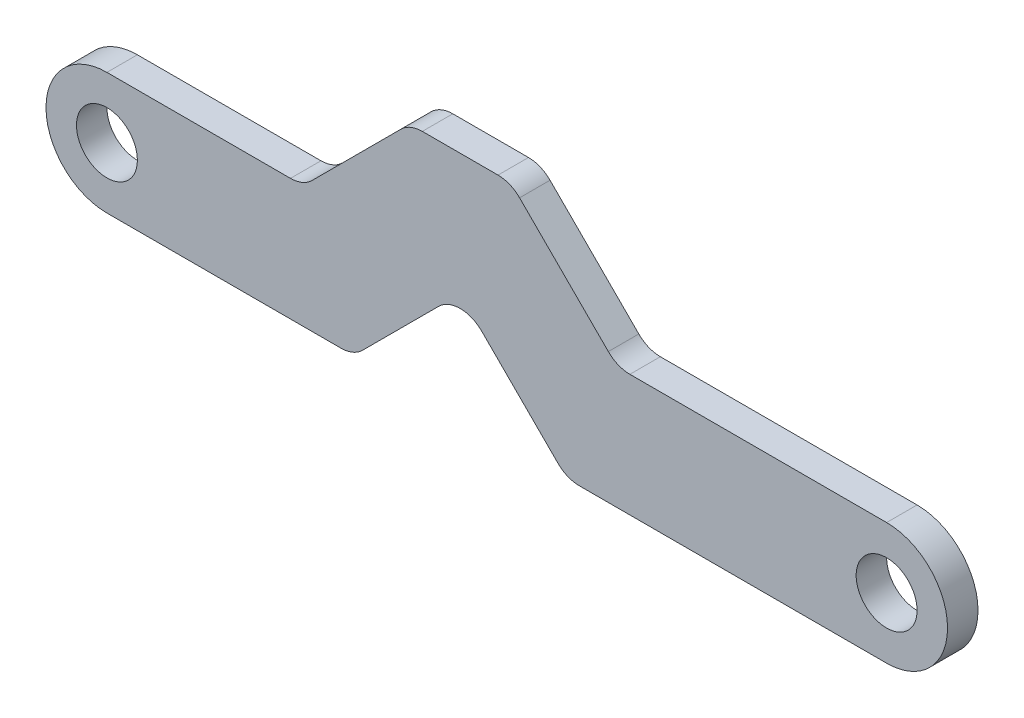
ISO-10303-21;
HEADER;
FILE_DESCRIPTION(('STEP AP214'),'2;1');
FILE_NAME('part.step','',(''),(''),'','','');
FILE_SCHEMA(('AUTOMOTIVE_DESIGN { 1 0 10303 214 1 1 1 1 }'));
ENDSEC;
DATA;
#1=APPLICATION_CONTEXT('core data for automotive mechanical design processes');
#2=APPLICATION_PROTOCOL_DEFINITION('international standard','automotive_design',2000,#1);
#3=PRODUCT_CONTEXT('',#1,'mechanical');
#4=PRODUCT('Part','Part','',(#3));
#5=PRODUCT_RELATED_PRODUCT_CATEGORY('part','',(#4));
#6=PRODUCT_DEFINITION_FORMATION('','',#4);
#7=PRODUCT_DEFINITION_CONTEXT('part definition',#1,'design');
#8=PRODUCT_DEFINITION('design','',#6,#7);
#9=PRODUCT_DEFINITION_SHAPE('','',#8);
#10=(LENGTH_UNIT() NAMED_UNIT(*) SI_UNIT(.MILLI.,.METRE.));
#11=(NAMED_UNIT(*) PLANE_ANGLE_UNIT() SI_UNIT($,.RADIAN.));
#12=(NAMED_UNIT(*) SI_UNIT($,.STERADIAN.) SOLID_ANGLE_UNIT());
#13=UNCERTAINTY_MEASURE_WITH_UNIT(LENGTH_MEASURE(1.E-05),#10,'distance_accuracy_value','');
#14=(GEOMETRIC_REPRESENTATION_CONTEXT(3) GLOBAL_UNCERTAINTY_ASSIGNED_CONTEXT((#13)) GLOBAL_UNIT_ASSIGNED_CONTEXT((#10,
#11,#12)) REPRESENTATION_CONTEXT('',''));
#15=CARTESIAN_POINT('',(0.,0.,0.));
#16=DIRECTION('',(0.,0.,1.));
#17=DIRECTION('',(1.,0.,0.));
#18=AXIS2_PLACEMENT_3D('',#15,#16,#17);
#19=CARTESIAN_POINT('',(0.,-2.,0.5));
#20=DIRECTION('',(0.,1.,0.));
#21=DIRECTION('',(-1.,0.,0.));
#22=AXIS2_PLACEMENT_3D('',#19,#20,#21);
#23=PLANE('',#22);
#24=DIRECTION('',(1.,0.,0.));
#25=VECTOR('',#24,1.);
#26=CARTESIAN_POINT('',(0.,-2.,0.5));
#27=LINE('',#26,#25);
#28=CARTESIAN_POINT('',(-10.0857864376269,-2.,0.5));
#29=VERTEX_POINT('',#28);
#30=CARTESIAN_POINT('',(0.,-2.,0.5));
#31=VERTEX_POINT('',#30);
#32=EDGE_CURVE('E163',#29,#31,#27,.T.);
#33=ORIENTED_EDGE('',*,*,#32,.F.);
#34=DIRECTION('',(0.,0.,1.));
#35=VECTOR('',#34,1.);
#36=CARTESIAN_POINT('',(-10.0857864376269,-2.,-0.5));
#37=LINE('',#36,#35);
#38=CARTESIAN_POINT('',(-10.0857864376269,-2.,-0.5));
#39=VERTEX_POINT('',#38);
#40=EDGE_CURVE('E53',#29,#39,#37,.F.);
#41=ORIENTED_EDGE('',*,*,#40,.T.);
#42=DIRECTION('',(1.,0.,0.));
#43=VECTOR('',#42,1.);
#44=CARTESIAN_POINT('',(0.,-2.,-0.5));
#45=LINE('',#44,#43);
#46=CARTESIAN_POINT('',(0.,-2.,-0.5));
#47=VERTEX_POINT('',#46);
#48=EDGE_CURVE('E185',#39,#47,#45,.T.);
#49=ORIENTED_EDGE('',*,*,#48,.T.);
#50=DIRECTION('',(0.,0.,-1.));
#51=VECTOR('',#50,1.);
#52=CARTESIAN_POINT('',(0.,-2.,0.5));
#53=LINE('',#52,#51);
#54=EDGE_CURVE('E180',#31,#47,#53,.T.);
#55=ORIENTED_EDGE('',*,*,#54,.F.);
#56=EDGE_LOOP('',(#33,#41,#49,#55));
#57=FACE_BOUND('',#56,.T.);
#58=ADVANCED_FACE('F38',(#57),#23,.F.);
#59=CARTESIAN_POINT('',(0.,0.,0.5));
#60=DIRECTION('',(0.,0.,1.));
#61=DIRECTION('',(1.,0.,0.));
#62=AXIS2_PLACEMENT_3D('',#59,#60,#61);
#63=PLANE('',#62);
#64=CARTESIAN_POINT('',(-25.5979,0.,0.5));
#65=DIRECTION('',(0.,0.,1.));
#66=DIRECTION('',(1.,0.,0.));
#67=AXIS2_PLACEMENT_3D('',#64,#65,#66);
#68=CIRCLE('',#67,1.);
#69=CARTESIAN_POINT('',(-24.5979,0.,0.5));
#70=VERTEX_POINT('',#69);
#71=EDGE_CURVE('E275',#70,#70,#68,.T.);
#72=ORIENTED_EDGE('',*,*,#71,.F.);
#73=EDGE_LOOP('',(#72));
#74=FACE_BOUND('',#73,.T.);
#75=CARTESIAN_POINT('',(0.,0.,0.5));
#76=DIRECTION('',(0.,0.,1.));
#77=DIRECTION('',(1.,0.,0.));
#78=AXIS2_PLACEMENT_3D('',#75,#76,#77);
#79=CIRCLE('',#78,1.);
#80=CARTESIAN_POINT('',(1.,0.,0.5));
#81=VERTEX_POINT('',#80);
#82=EDGE_CURVE('E278',#81,#81,#79,.T.);
#83=ORIENTED_EDGE('',*,*,#82,.F.);
#84=EDGE_LOOP('',(#83));
#85=FACE_BOUND('',#84,.T.);
#86=DIRECTION('',(0.707106781186548,-0.707106781186548,0.));
#87=VECTOR('',#86,1.);
#88=CARTESIAN_POINT('',(-3.42157287525381,-3.42157287525381,0.5));
#89=LINE('',#88,#87);
#90=CARTESIAN_POINT('',(-12.0502525316942,5.20710678118655,0.5));
#91=VERTEX_POINT('',#90);
#92=CARTESIAN_POINT('',(-9.13603896932107,2.29289321881345,0.5));
#93=VERTEX_POINT('',#92);
#94=EDGE_CURVE('E268',#91,#93,#89,.T.);
#95=ORIENTED_EDGE('',*,*,#94,.F.);
#96=CARTESIAN_POINT('',(-12.7573593128807,4.5,0.5));
#97=DIRECTION('',(0.,0.,1.));
#98=DIRECTION('',(1.,0.,0.));
#99=AXIS2_PLACEMENT_3D('',#96,#97,#98);
#100=CIRCLE('',#99,1.);
#101=CARTESIAN_POINT('',(-12.7573593128807,5.5,0.5));
#102=VERTEX_POINT('',#101);
#103=EDGE_CURVE('E230',#91,#102,#100,.T.);
#104=ORIENTED_EDGE('',*,*,#103,.T.);
#105=DIRECTION('',(1.,0.,0.));
#106=VECTOR('',#105,1.);
#107=CARTESIAN_POINT('',(0.,5.5,0.5));
#108=LINE('',#107,#106);
#109=CARTESIAN_POINT('',(-15.2426406871193,5.5,0.5));
#110=VERTEX_POINT('',#109);
#111=EDGE_CURVE('E324',#110,#102,#108,.T.);
#112=ORIENTED_EDGE('',*,*,#111,.F.);
#113=CARTESIAN_POINT('',(-15.2426406871193,4.5,0.5));
#114=DIRECTION('',(0.,0.,1.));
#115=DIRECTION('',(1.,0.,0.));
#116=AXIS2_PLACEMENT_3D('',#113,#114,#115);
#117=CIRCLE('',#116,1.);
#118=CARTESIAN_POINT('',(-15.9497474683058,5.20710678118654,0.5));
#119=VERTEX_POINT('',#118);
#120=EDGE_CURVE('E228',#110,#119,#117,.T.);
#121=ORIENTED_EDGE('',*,*,#120,.T.);
#122=DIRECTION('',(-0.707106781186548,-0.707106781186548,0.));
#123=VECTOR('',#122,1.);
#124=CARTESIAN_POINT('',(-10.5784271247462,10.5784271247462,0.5));
#125=LINE('',#124,#123);
#126=CARTESIAN_POINT('',(-18.8639610306789,2.29289321881345,0.5));
#127=VERTEX_POINT('',#126);
#128=EDGE_CURVE('E326',#119,#127,#125,.T.);
#129=ORIENTED_EDGE('',*,*,#128,.T.);
#130=CARTESIAN_POINT('',(-19.5710678118655,3.,0.5));
#131=DIRECTION('',(0.,0.,1.));
#132=DIRECTION('',(1.,0.,0.));
#133=AXIS2_PLACEMENT_3D('',#130,#131,#132);
#134=CIRCLE('',#133,1.);
#135=CARTESIAN_POINT('',(-19.5710678118655,2.,0.5));
#136=VERTEX_POINT('',#135);
#137=EDGE_CURVE('E217',#127,#136,#134,.F.);
#138=ORIENTED_EDGE('',*,*,#137,.T.);
#139=DIRECTION('',(1.,0.,0.));
#140=VECTOR('',#139,1.);
#141=CARTESIAN_POINT('',(0.,2.,0.5));
#142=LINE('',#141,#140);
#143=CARTESIAN_POINT('',(-25.5979,2.,0.5));
#144=VERTEX_POINT('',#143);
#145=EDGE_CURVE('E271',#144,#136,#142,.T.);
#146=ORIENTED_EDGE('',*,*,#145,.F.);
#147=CARTESIAN_POINT('',(-25.5979,0.,0.5));
#148=DIRECTION('',(0.,0.,1.));
#149=DIRECTION('',(1.,0.,0.));
#150=AXIS2_PLACEMENT_3D('',#147,#148,#149);
#151=CIRCLE('',#150,2.);
#152=CARTESIAN_POINT('',(-25.5979,-2.,0.5));
#153=VERTEX_POINT('',#152);
#154=EDGE_CURVE('E265',#144,#153,#151,.T.);
#155=ORIENTED_EDGE('',*,*,#154,.T.);
#156=CARTESIAN_POINT('',(-17.9142135623731,-2.,0.5));
#157=VERTEX_POINT('',#156);
#158=EDGE_CURVE('E173',#153,#157,#27,.T.);
#159=ORIENTED_EDGE('',*,*,#158,.T.);
#160=CARTESIAN_POINT('',(-17.9142135623731,-1.,0.5));
#161=DIRECTION('',(0.,0.,1.));
#162=DIRECTION('',(1.,0.,0.));
#163=AXIS2_PLACEMENT_3D('',#160,#161,#162);
#164=CIRCLE('',#163,1.);
#165=CARTESIAN_POINT('',(-17.2071067811865,-1.70710678118655,0.5));
#166=VERTEX_POINT('',#165);
#167=EDGE_CURVE('E225',#157,#166,#164,.T.);
#168=ORIENTED_EDGE('',*,*,#167,.T.);
#169=DIRECTION('',(-0.707106781186548,-0.707106781186548,0.));
#170=VECTOR('',#169,1.);
#171=CARTESIAN_POINT('',(-7.75,7.75,0.5));
#172=LINE('',#171,#170);
#173=CARTESIAN_POINT('',(-14.7071067811865,0.79289321881345,0.5));
#174=VERTEX_POINT('',#173);
#175=EDGE_CURVE('E335',#174,#166,#172,.T.);
#176=ORIENTED_EDGE('',*,*,#175,.F.);
#177=CARTESIAN_POINT('',(-14.,0.0857864376269026,0.5));
#178=DIRECTION('',(0.,0.,1.));
#179=DIRECTION('',(1.,0.,0.));
#180=AXIS2_PLACEMENT_3D('',#177,#178,#179);
#181=CIRCLE('',#180,1.);
#182=CARTESIAN_POINT('',(-13.2928932188135,0.79289321881345,0.5));
#183=VERTEX_POINT('',#182);
#184=EDGE_CURVE('E213',#174,#183,#181,.F.);
#185=ORIENTED_EDGE('',*,*,#184,.T.);
#186=DIRECTION('',(0.707106781186548,-0.707106781186548,0.));
#187=VECTOR('',#186,1.);
#188=CARTESIAN_POINT('',(-6.25,-6.25,0.5));
#189=LINE('',#188,#187);
#190=CARTESIAN_POINT('',(-10.7928932188135,-1.70710678118655,0.5));
#191=VERTEX_POINT('',#190);
#192=EDGE_CURVE('E337',#183,#191,#189,.T.);
#193=ORIENTED_EDGE('',*,*,#192,.T.);
#194=CARTESIAN_POINT('',(-10.0857864376269,-1.,0.5));
#195=DIRECTION('',(0.,0.,1.));
#196=DIRECTION('',(1.,0.,0.));
#197=AXIS2_PLACEMENT_3D('',#194,#195,#196);
#198=CIRCLE('',#197,1.);
#199=EDGE_CURVE('E171',#191,#29,#198,.T.);
#200=ORIENTED_EDGE('',*,*,#199,.T.);
#201=ORIENTED_EDGE('',*,*,#32,.T.);
#202=CARTESIAN_POINT('',(0.,0.,0.5));
#203=DIRECTION('',(0.,0.,1.));
#204=DIRECTION('',(1.,0.,0.));
#205=AXIS2_PLACEMENT_3D('',#202,#203,#204);
#206=CIRCLE('',#205,2.);
#207=CARTESIAN_POINT('',(0.,2.,0.5));
#208=VERTEX_POINT('',#207);
#209=EDGE_CURVE('E168',#31,#208,#206,.T.);
#210=ORIENTED_EDGE('',*,*,#209,.T.);
#211=CARTESIAN_POINT('',(-8.42893218813453,2.,0.5));
#212=VERTEX_POINT('',#211);
#213=EDGE_CURVE('E183',#212,#208,#142,.T.);
#214=ORIENTED_EDGE('',*,*,#213,.F.);
#215=CARTESIAN_POINT('',(-8.42893218813453,3.,0.5));
#216=DIRECTION('',(0.,0.,1.));
#217=DIRECTION('',(1.,0.,0.));
#218=AXIS2_PLACEMENT_3D('',#215,#216,#217);
#219=CIRCLE('',#218,1.);
#220=EDGE_CURVE('E208',#212,#93,#219,.F.);
#221=ORIENTED_EDGE('',*,*,#220,.T.);
#222=EDGE_LOOP('',(#95,#104,#112,#121,#129,#138,#146,#155,#159,#168,#176,#185,#193,#200,#201,
#210,#214,#221));
#223=FACE_BOUND('',#222,.T.);
#224=ADVANCED_FACE('F166',(#74,#85,#223),#63,.T.);
#225=CARTESIAN_POINT('',(0.,0.,-0.5));
#226=DIRECTION('',(0.,0.,1.));
#227=DIRECTION('',(1.,0.,0.));
#228=AXIS2_PLACEMENT_3D('',#225,#226,#227);
#229=PLANE('',#228);
#230=CARTESIAN_POINT('',(-25.5979,0.,-0.5));
#231=DIRECTION('',(0.,0.,1.));
#232=DIRECTION('',(1.,0.,0.));
#233=AXIS2_PLACEMENT_3D('',#230,#231,#232);
#234=CIRCLE('',#233,1.);
#235=CARTESIAN_POINT('',(-24.5979,0.,-0.5));
#236=VERTEX_POINT('',#235);
#237=EDGE_CURVE('E291',#236,#236,#234,.T.);
#238=ORIENTED_EDGE('',*,*,#237,.T.);
#239=EDGE_LOOP('',(#238));
#240=FACE_BOUND('',#239,.T.);
#241=CARTESIAN_POINT('',(0.,0.,-0.5));
#242=DIRECTION('',(0.,0.,1.));
#243=DIRECTION('',(1.,0.,0.));
#244=AXIS2_PLACEMENT_3D('',#241,#242,#243);
#245=CIRCLE('',#244,1.);
#246=CARTESIAN_POINT('',(1.,0.,-0.5));
#247=VERTEX_POINT('',#246);
#248=EDGE_CURVE('E174',#247,#247,#245,.T.);
#249=ORIENTED_EDGE('',*,*,#248,.T.);
#250=EDGE_LOOP('',(#249));
#251=FACE_BOUND('',#250,.T.);
#252=DIRECTION('',(1.,0.,0.));
#253=VECTOR('',#252,1.);
#254=CARTESIAN_POINT('',(0.,5.5,-0.5));
#255=LINE('',#254,#253);
#256=CARTESIAN_POINT('',(-15.2426406871193,5.5,-0.5));
#257=VERTEX_POINT('',#256);
#258=CARTESIAN_POINT('',(-12.7573593128807,5.5,-0.5));
#259=VERTEX_POINT('',#258);
#260=EDGE_CURVE('E315',#257,#259,#255,.T.);
#261=ORIENTED_EDGE('',*,*,#260,.T.);
#262=CARTESIAN_POINT('',(-12.7573593128807,4.5,-0.5));
#263=DIRECTION('',(0.,0.,1.));
#264=DIRECTION('',(1.,0.,0.));
#265=AXIS2_PLACEMENT_3D('',#262,#263,#264);
#266=CIRCLE('',#265,1.);
#267=CARTESIAN_POINT('',(-12.0502525316942,5.20710678118655,-0.5));
#268=VERTEX_POINT('',#267);
#269=EDGE_CURVE('E243',#259,#268,#266,.F.);
#270=ORIENTED_EDGE('',*,*,#269,.T.);
#271=DIRECTION('',(0.707106781186548,-0.707106781186548,0.));
#272=VECTOR('',#271,1.);
#273=CARTESIAN_POINT('',(-3.42157287525381,-3.42157287525381,-0.5));
#274=LINE('',#273,#272);
#275=CARTESIAN_POINT('',(-9.13603896932107,2.29289321881345,-0.5));
#276=VERTEX_POINT('',#275);
#277=EDGE_CURVE('E314',#268,#276,#274,.T.);
#278=ORIENTED_EDGE('',*,*,#277,.T.);
#279=CARTESIAN_POINT('',(-8.42893218813453,3.,-0.5));
#280=DIRECTION('',(0.,0.,1.));
#281=DIRECTION('',(1.,0.,0.));
#282=AXIS2_PLACEMENT_3D('',#279,#280,#281);
#283=CIRCLE('',#282,1.);
#284=CARTESIAN_POINT('',(-8.42893218813453,2.,-0.5));
#285=VERTEX_POINT('',#284);
#286=EDGE_CURVE('E211',#276,#285,#283,.T.);
#287=ORIENTED_EDGE('',*,*,#286,.T.);
#288=DIRECTION('',(1.,0.,0.));
#289=VECTOR('',#288,1.);
#290=CARTESIAN_POINT('',(0.,2.,-0.5));
#291=LINE('',#290,#289);
#292=CARTESIAN_POINT('',(0.,2.,-0.5));
#293=VERTEX_POINT('',#292);
#294=EDGE_CURVE('E285',#285,#293,#291,.T.);
#295=ORIENTED_EDGE('',*,*,#294,.T.);
#296=CARTESIAN_POINT('',(0.,0.,-0.5));
#297=DIRECTION('',(0.,0.,1.));
#298=DIRECTION('',(1.,0.,0.));
#299=AXIS2_PLACEMENT_3D('',#296,#297,#298);
#300=CIRCLE('',#299,2.);
#301=EDGE_CURVE('E283',#47,#293,#300,.T.);
#302=ORIENTED_EDGE('',*,*,#301,.F.);
#303=ORIENTED_EDGE('',*,*,#48,.F.);
#304=CARTESIAN_POINT('',(-10.0857864376269,-1.,-0.5));
#305=DIRECTION('',(0.,0.,1.));
#306=DIRECTION('',(1.,0.,0.));
#307=AXIS2_PLACEMENT_3D('',#304,#305,#306);
#308=CIRCLE('',#307,1.);
#309=CARTESIAN_POINT('',(-10.7928932188135,-1.70710678118655,-0.5));
#310=VERTEX_POINT('',#309);
#311=EDGE_CURVE('E239',#39,#310,#308,.F.);
#312=ORIENTED_EDGE('',*,*,#311,.T.);
#313=DIRECTION('',(0.707106781186548,-0.707106781186548,0.));
#314=VECTOR('',#313,1.);
#315=CARTESIAN_POINT('',(-6.25,-6.25,-0.5));
#316=LINE('',#315,#314);
#317=CARTESIAN_POINT('',(-13.2928932188135,0.79289321881345,-0.5));
#318=VERTEX_POINT('',#317);
#319=EDGE_CURVE('E330',#318,#310,#316,.T.);
#320=ORIENTED_EDGE('',*,*,#319,.F.);
#321=CARTESIAN_POINT('',(-14.,0.0857864376269026,-0.5));
#322=DIRECTION('',(0.,0.,1.));
#323=DIRECTION('',(1.,0.,0.));
#324=AXIS2_PLACEMENT_3D('',#321,#322,#323);
#325=CIRCLE('',#324,1.);
#326=CARTESIAN_POINT('',(-14.7071067811865,0.79289321881345,-0.5));
#327=VERTEX_POINT('',#326);
#328=EDGE_CURVE('E215',#318,#327,#325,.T.);
#329=ORIENTED_EDGE('',*,*,#328,.T.);
#330=DIRECTION('',(-0.707106781186548,-0.707106781186548,0.));
#331=VECTOR('',#330,1.);
#332=CARTESIAN_POINT('',(-7.75,7.75,-0.5));
#333=LINE('',#332,#331);
#334=CARTESIAN_POINT('',(-17.2071067811865,-1.70710678118655,-0.5));
#335=VERTEX_POINT('',#334);
#336=EDGE_CURVE('E327',#327,#335,#333,.T.);
#337=ORIENTED_EDGE('',*,*,#336,.T.);
#338=CARTESIAN_POINT('',(-17.9142135623731,-1.,-0.5));
#339=DIRECTION('',(0.,0.,1.));
#340=DIRECTION('',(1.,0.,0.));
#341=AXIS2_PLACEMENT_3D('',#338,#339,#340);
#342=CIRCLE('',#341,1.);
#343=CARTESIAN_POINT('',(-17.9142135623731,-2.,-0.5));
#344=VERTEX_POINT('',#343);
#345=EDGE_CURVE('E237',#335,#344,#342,.F.);
#346=ORIENTED_EDGE('',*,*,#345,.T.);
#347=CARTESIAN_POINT('',(-25.5979,-2.,-0.5));
#348=VERTEX_POINT('',#347);
#349=EDGE_CURVE('E258',#348,#344,#45,.T.);
#350=ORIENTED_EDGE('',*,*,#349,.F.);
#351=CARTESIAN_POINT('',(-25.5979,0.,-0.5));
#352=DIRECTION('',(0.,0.,1.));
#353=DIRECTION('',(1.,0.,0.));
#354=AXIS2_PLACEMENT_3D('',#351,#352,#353);
#355=CIRCLE('',#354,2.);
#356=CARTESIAN_POINT('',(-25.5979,2.,-0.5));
#357=VERTEX_POINT('',#356);
#358=EDGE_CURVE('E289',#357,#348,#355,.T.);
#359=ORIENTED_EDGE('',*,*,#358,.F.);
#360=CARTESIAN_POINT('',(-19.5710678118655,2.,-0.5));
#361=VERTEX_POINT('',#360);
#362=EDGE_CURVE('E286',#357,#361,#291,.T.);
#363=ORIENTED_EDGE('',*,*,#362,.T.);
#364=CARTESIAN_POINT('',(-19.5710678118655,3.,-0.5));
#365=DIRECTION('',(0.,0.,1.));
#366=DIRECTION('',(1.,0.,0.));
#367=AXIS2_PLACEMENT_3D('',#364,#365,#366);
#368=CIRCLE('',#367,1.);
#369=CARTESIAN_POINT('',(-18.8639610306789,2.29289321881345,-0.5));
#370=VERTEX_POINT('',#369);
#371=EDGE_CURVE('E219',#361,#370,#368,.T.);
#372=ORIENTED_EDGE('',*,*,#371,.T.);
#373=DIRECTION('',(-0.707106781186548,-0.707106781186548,0.));
#374=VECTOR('',#373,1.);
#375=CARTESIAN_POINT('',(-10.5784271247462,10.5784271247462,-0.5));
#376=LINE('',#375,#374);
#377=CARTESIAN_POINT('',(-15.9497474683058,5.20710678118654,-0.5));
#378=VERTEX_POINT('',#377);
#379=EDGE_CURVE('E311',#378,#370,#376,.T.);
#380=ORIENTED_EDGE('',*,*,#379,.F.);
#381=CARTESIAN_POINT('',(-15.2426406871193,4.5,-0.5));
#382=DIRECTION('',(0.,0.,1.));
#383=DIRECTION('',(1.,0.,0.));
#384=AXIS2_PLACEMENT_3D('',#381,#382,#383);
#385=CIRCLE('',#384,1.);
#386=EDGE_CURVE('E241',#378,#257,#385,.F.);
#387=ORIENTED_EDGE('',*,*,#386,.T.);
#388=EDGE_LOOP('',(#261,#270,#278,#287,#295,#302,#303,#312,#320,#329,#337,#346,#350,#359,#363,
#372,#380,#387));
#389=FACE_BOUND('',#388,.T.);
#390=ADVANCED_FACE('F303',(#240,#251,#389),#229,.F.);
#391=CARTESIAN_POINT('',(0.,2.,0.5));
#392=DIRECTION('',(0.,1.,0.));
#393=DIRECTION('',(-1.,0.,0.));
#394=AXIS2_PLACEMENT_3D('',#391,#392,#393);
#395=PLANE('',#394);
#396=ORIENTED_EDGE('',*,*,#294,.F.);
#397=DIRECTION('',(0.,0.,1.));
#398=VECTOR('',#397,1.);
#399=CARTESIAN_POINT('',(-8.42893218813453,2.,0.5));
#400=LINE('',#399,#398);
#401=EDGE_CURVE('E187',#285,#212,#400,.T.);
#402=ORIENTED_EDGE('',*,*,#401,.T.);
#403=ORIENTED_EDGE('',*,*,#213,.T.);
#404=DIRECTION('',(0.,0.,-1.));
#405=VECTOR('',#404,1.);
#406=CARTESIAN_POINT('',(0.,2.,0.5));
#407=LINE('',#406,#405);
#408=EDGE_CURVE('E182',#208,#293,#407,.T.);
#409=ORIENTED_EDGE('',*,*,#408,.T.);
#410=EDGE_LOOP('',(#396,#402,#403,#409));
#411=FACE_BOUND('',#410,.T.);
#412=ADVANCED_FACE('F354',(#411),#395,.T.);
#413=ORIENTED_EDGE('',*,*,#349,.T.);
#414=DIRECTION('',(0.,0.,1.));
#415=VECTOR('',#414,1.);
#416=CARTESIAN_POINT('',(-17.9142135623731,-2.,0.5));
#417=LINE('',#416,#415);
#418=EDGE_CURVE('E46',#344,#157,#417,.T.);
#419=ORIENTED_EDGE('',*,*,#418,.T.);
#420=ORIENTED_EDGE('',*,*,#158,.F.);
#421=DIRECTION('',(0.,0.,-1.));
#422=VECTOR('',#421,1.);
#423=CARTESIAN_POINT('',(-25.5979,-2.,0.5));
#424=LINE('',#423,#422);
#425=EDGE_CURVE('E281',#153,#348,#424,.T.);
#426=ORIENTED_EDGE('',*,*,#425,.T.);
#427=EDGE_LOOP('',(#413,#419,#420,#426));
#428=FACE_BOUND('',#427,.T.);
#429=ADVANCED_FACE('F255',(#428),#23,.F.);
#430=CARTESIAN_POINT('',(0.,0.,0.5));
#431=DIRECTION('',(0.,0.,-1.));
#432=DIRECTION('',(-1.,0.,0.));
#433=AXIS2_PLACEMENT_3D('',#430,#431,#432);
#434=CYLINDRICAL_SURFACE('',#433,2.);
#435=ORIENTED_EDGE('',*,*,#301,.T.);
#436=ORIENTED_EDGE('',*,*,#408,.F.);
#437=ORIENTED_EDGE('',*,*,#209,.F.);
#438=ORIENTED_EDGE('',*,*,#54,.T.);
#439=EDGE_LOOP('',(#435,#436,#437,#438));
#440=FACE_BOUND('',#439,.T.);
#441=ADVANCED_FACE('F179',(#440),#434,.T.);
#442=ORIENTED_EDGE('',*,*,#145,.T.);
#443=DIRECTION('',(0.,0.,1.));
#444=VECTOR('',#443,1.);
#445=CARTESIAN_POINT('',(-19.5710678118655,2.,-0.5));
#446=LINE('',#445,#444);
#447=EDGE_CURVE('E206',#136,#361,#446,.F.);
#448=ORIENTED_EDGE('',*,*,#447,.T.);
#449=ORIENTED_EDGE('',*,*,#362,.F.);
#450=DIRECTION('',(0.,0.,-1.));
#451=VECTOR('',#450,1.);
#452=CARTESIAN_POINT('',(-25.5979,2.,0.5));
#453=LINE('',#452,#451);
#454=EDGE_CURVE('E192',#144,#357,#453,.T.);
#455=ORIENTED_EDGE('',*,*,#454,.F.);
#456=EDGE_LOOP('',(#442,#448,#449,#455));
#457=FACE_BOUND('',#456,.T.);
#458=ADVANCED_FACE('F305',(#457),#395,.T.);
#459=CARTESIAN_POINT('',(-25.5979,0.,0.5));
#460=DIRECTION('',(0.,0.,-1.));
#461=DIRECTION('',(-1.,0.,0.));
#462=AXIS2_PLACEMENT_3D('',#459,#460,#461);
#463=CYLINDRICAL_SURFACE('',#462,1.);
#464=ORIENTED_EDGE('',*,*,#71,.T.);
#465=EDGE_LOOP('',(#464));
#466=FACE_BOUND('',#465,.T.);
#467=ORIENTED_EDGE('',*,*,#237,.F.);
#468=EDGE_LOOP('',(#467));
#469=FACE_BOUND('',#468,.T.);
#470=ADVANCED_FACE('F396',(#466,#469),#463,.F.);
#471=CARTESIAN_POINT('',(-25.5979,0.,0.5));
#472=DIRECTION('',(0.,0.,-1.));
#473=DIRECTION('',(-1.,0.,0.));
#474=AXIS2_PLACEMENT_3D('',#471,#472,#473);
#475=CYLINDRICAL_SURFACE('',#474,2.);
#476=ORIENTED_EDGE('',*,*,#358,.T.);
#477=ORIENTED_EDGE('',*,*,#425,.F.);
#478=ORIENTED_EDGE('',*,*,#154,.F.);
#479=ORIENTED_EDGE('',*,*,#454,.T.);
#480=EDGE_LOOP('',(#476,#477,#478,#479));
#481=FACE_BOUND('',#480,.T.);
#482=ADVANCED_FACE('F298',(#481),#475,.T.);
#483=CARTESIAN_POINT('',(0.,0.,0.5));
#484=DIRECTION('',(0.,0.,-1.));
#485=DIRECTION('',(-1.,0.,0.));
#486=AXIS2_PLACEMENT_3D('',#483,#484,#485);
#487=CYLINDRICAL_SURFACE('',#486,1.);
#488=ORIENTED_EDGE('',*,*,#82,.T.);
#489=EDGE_LOOP('',(#488));
#490=FACE_BOUND('',#489,.T.);
#491=ORIENTED_EDGE('',*,*,#248,.F.);
#492=EDGE_LOOP('',(#491));
#493=FACE_BOUND('',#492,.T.);
#494=ADVANCED_FACE('F405',(#490,#493),#487,.F.);
#495=CARTESIAN_POINT('',(0.,5.5,-0.5));
#496=DIRECTION('',(0.,-1.,0.));
#497=DIRECTION('',(0.,0.,-1.));
#498=AXIS2_PLACEMENT_3D('',#495,#496,#497);
#499=PLANE('',#498);
#500=ORIENTED_EDGE('',*,*,#111,.T.);
#501=DIRECTION('',(0.,0.,1.));
#502=VECTOR('',#501,1.);
#503=CARTESIAN_POINT('',(-12.7573593128807,5.5,-0.5));
#504=LINE('',#503,#502);
#505=EDGE_CURVE('E235',#102,#259,#504,.F.);
#506=ORIENTED_EDGE('',*,*,#505,.T.);
#507=ORIENTED_EDGE('',*,*,#260,.F.);
#508=DIRECTION('',(0.,0.,1.));
#509=VECTOR('',#508,1.);
#510=CARTESIAN_POINT('',(-15.2426406871193,5.5,0.5));
#511=LINE('',#510,#509);
#512=EDGE_CURVE('E232',#257,#110,#511,.T.);
#513=ORIENTED_EDGE('',*,*,#512,.T.);
#514=EDGE_LOOP('',(#500,#506,#507,#513));
#515=FACE_BOUND('',#514,.T.);
#516=ADVANCED_FACE('F323',(#515),#499,.F.);
#517=CARTESIAN_POINT('',(-3.42157287525381,-3.42157287525381,-0.5));
#518=DIRECTION('',(-0.707106781186547,-0.707106781186547,0.));
#519=DIRECTION('',(0.707106781186548,-0.707106781186548,0.));
#520=AXIS2_PLACEMENT_3D('',#517,#518,#519);
#521=PLANE('',#520);
#522=ORIENTED_EDGE('',*,*,#277,.F.);
#523=DIRECTION('',(0.,0.,1.));
#524=VECTOR('',#523,1.);
#525=CARTESIAN_POINT('',(-12.0502525316942,5.20710678118655,-0.5));
#526=LINE('',#525,#524);
#527=EDGE_CURVE('E222',#268,#91,#526,.T.);
#528=ORIENTED_EDGE('',*,*,#527,.T.);
#529=ORIENTED_EDGE('',*,*,#94,.T.);
#530=DIRECTION('',(0.,0.,1.));
#531=VECTOR('',#530,1.);
#532=CARTESIAN_POINT('',(-9.13603896932107,2.29289321881345,-0.5));
#533=LINE('',#532,#531);
#534=EDGE_CURVE('E190',#93,#276,#533,.F.);
#535=ORIENTED_EDGE('',*,*,#534,.T.);
#536=EDGE_LOOP('',(#522,#528,#529,#535));
#537=FACE_BOUND('',#536,.T.);
#538=ADVANCED_FACE('F360',(#537),#521,.F.);
#539=CARTESIAN_POINT('',(-10.5784271247462,10.5784271247462,-0.5));
#540=DIRECTION('',(-0.707106781186547,0.707106781186547,0.));
#541=DIRECTION('',(-0.707106781186548,-0.707106781186548,0.));
#542=AXIS2_PLACEMENT_3D('',#539,#540,#541);
#543=PLANE('',#542);
#544=ORIENTED_EDGE('',*,*,#128,.F.);
#545=DIRECTION('',(0.,0.,1.));
#546=VECTOR('',#545,1.);
#547=CARTESIAN_POINT('',(-15.9497474683058,5.20710678118654,-0.5));
#548=LINE('',#547,#546);
#549=EDGE_CURVE('E61',#119,#378,#548,.F.);
#550=ORIENTED_EDGE('',*,*,#549,.T.);
#551=ORIENTED_EDGE('',*,*,#379,.T.);
#552=DIRECTION('',(0.,0.,1.));
#553=VECTOR('',#552,1.);
#554=CARTESIAN_POINT('',(-18.8639610306789,2.29289321881345,0.5));
#555=LINE('',#554,#553);
#556=EDGE_CURVE('E203',#370,#127,#555,.T.);
#557=ORIENTED_EDGE('',*,*,#556,.T.);
#558=EDGE_LOOP('',(#544,#550,#551,#557));
#559=FACE_BOUND('',#558,.T.);
#560=ADVANCED_FACE('F413',(#559),#543,.T.);
#561=CARTESIAN_POINT('',(-6.25,-6.25,-0.5));
#562=DIRECTION('',(-0.707106781186547,-0.707106781186547,0.));
#563=DIRECTION('',(0.707106781186548,-0.707106781186548,0.));
#564=AXIS2_PLACEMENT_3D('',#561,#562,#563);
#565=PLANE('',#564);
#566=ORIENTED_EDGE('',*,*,#319,.T.);
#567=DIRECTION('',(0.,0.,1.));
#568=VECTOR('',#567,1.);
#569=CARTESIAN_POINT('',(-10.7928932188135,-1.70710678118655,0.5));
#570=LINE('',#569,#568);
#571=EDGE_CURVE('E246',#310,#191,#570,.T.);
#572=ORIENTED_EDGE('',*,*,#571,.T.);
#573=ORIENTED_EDGE('',*,*,#192,.F.);
#574=DIRECTION('',(0.,0.,1.));
#575=VECTOR('',#574,1.);
#576=CARTESIAN_POINT('',(-13.2928932188135,0.792893218813449,-0.5));
#577=LINE('',#576,#575);
#578=EDGE_CURVE('E201',#183,#318,#577,.F.);
#579=ORIENTED_EDGE('',*,*,#578,.T.);
#580=EDGE_LOOP('',(#566,#572,#573,#579));
#581=FACE_BOUND('',#580,.T.);
#582=ADVANCED_FACE('F343',(#581),#565,.T.);
#583=CARTESIAN_POINT('',(-7.75,7.75,-0.5));
#584=DIRECTION('',(-0.707106781186547,0.707106781186547,0.));
#585=DIRECTION('',(-0.707106781186548,-0.707106781186548,0.));
#586=AXIS2_PLACEMENT_3D('',#583,#584,#585);
#587=PLANE('',#586);
#588=ORIENTED_EDGE('',*,*,#175,.T.);
#589=DIRECTION('',(0.,0.,1.));
#590=VECTOR('',#589,1.);
#591=CARTESIAN_POINT('',(-17.2071067811865,-1.70710678118655,-0.5));
#592=LINE('',#591,#590);
#593=EDGE_CURVE('E11',#166,#335,#592,.F.);
#594=ORIENTED_EDGE('',*,*,#593,.T.);
#595=ORIENTED_EDGE('',*,*,#336,.F.);
#596=DIRECTION('',(0.,0.,1.));
#597=VECTOR('',#596,1.);
#598=CARTESIAN_POINT('',(-14.7071067811865,0.792893218813452,-0.5));
#599=LINE('',#598,#597);
#600=EDGE_CURVE('E198',#327,#174,#599,.T.);
#601=ORIENTED_EDGE('',*,*,#600,.T.);
#602=EDGE_LOOP('',(#588,#594,#595,#601));
#603=FACE_BOUND('',#602,.T.);
#604=ADVANCED_FACE('F420',(#603),#587,.F.);
#605=CARTESIAN_POINT('',(-8.42893218813453,3.,0.5));
#606=DIRECTION('',(0.,0.,1.));
#607=DIRECTION('',(1.,0.,0.));
#608=AXIS2_PLACEMENT_3D('',#605,#606,#607);
#609=CYLINDRICAL_SURFACE('',#608,1.);
#610=ORIENTED_EDGE('',*,*,#286,.F.);
#611=ORIENTED_EDGE('',*,*,#534,.F.);
#612=ORIENTED_EDGE('',*,*,#220,.F.);
#613=ORIENTED_EDGE('',*,*,#401,.F.);
#614=EDGE_LOOP('',(#610,#611,#612,#613));
#615=FACE_BOUND('',#614,.T.);
#616=ADVANCED_FACE('F357',(#615),#609,.F.);
#617=CARTESIAN_POINT('',(-14.,0.0857864376269026,-0.5));
#618=DIRECTION('',(0.,0.,1.));
#619=DIRECTION('',(1.,0.,0.));
#620=AXIS2_PLACEMENT_3D('',#617,#618,#619);
#621=CYLINDRICAL_SURFACE('',#620,1.);
#622=ORIENTED_EDGE('',*,*,#328,.F.);
#623=ORIENTED_EDGE('',*,*,#578,.F.);
#624=ORIENTED_EDGE('',*,*,#184,.F.);
#625=ORIENTED_EDGE('',*,*,#600,.F.);
#626=EDGE_LOOP('',(#622,#623,#624,#625));
#627=FACE_BOUND('',#626,.T.);
#628=ADVANCED_FACE('F372',(#627),#621,.F.);
#629=CARTESIAN_POINT('',(-19.5710678118655,3.,-0.5));
#630=DIRECTION('',(0.,0.,-1.));
#631=DIRECTION('',(-1.,0.,0.));
#632=AXIS2_PLACEMENT_3D('',#629,#630,#631);
#633=CYLINDRICAL_SURFACE('',#632,1.);
#634=ORIENTED_EDGE('',*,*,#371,.F.);
#635=ORIENTED_EDGE('',*,*,#447,.F.);
#636=ORIENTED_EDGE('',*,*,#137,.F.);
#637=ORIENTED_EDGE('',*,*,#556,.F.);
#638=EDGE_LOOP('',(#634,#635,#636,#637));
#639=FACE_BOUND('',#638,.T.);
#640=ADVANCED_FACE('F309',(#639),#633,.F.);
#641=CARTESIAN_POINT('',(-12.7573593128807,4.5,-0.5));
#642=DIRECTION('',(0.,0.,1.));
#643=DIRECTION('',(1.,0.,0.));
#644=AXIS2_PLACEMENT_3D('',#641,#642,#643);
#645=CYLINDRICAL_SURFACE('',#644,1.);
#646=ORIENTED_EDGE('',*,*,#269,.F.);
#647=ORIENTED_EDGE('',*,*,#505,.F.);
#648=ORIENTED_EDGE('',*,*,#103,.F.);
#649=ORIENTED_EDGE('',*,*,#527,.F.);
#650=EDGE_LOOP('',(#646,#647,#648,#649));
#651=FACE_BOUND('',#650,.T.);
#652=ADVANCED_FACE('F364',(#651),#645,.T.);
#653=CARTESIAN_POINT('',(-15.2426406871193,4.5,-0.5));
#654=DIRECTION('',(0.,0.,-1.));
#655=DIRECTION('',(-1.,0.,0.));
#656=AXIS2_PLACEMENT_3D('',#653,#654,#655);
#657=CYLINDRICAL_SURFACE('',#656,1.);
#658=ORIENTED_EDGE('',*,*,#386,.F.);
#659=ORIENTED_EDGE('',*,*,#549,.F.);
#660=ORIENTED_EDGE('',*,*,#120,.F.);
#661=ORIENTED_EDGE('',*,*,#512,.F.);
#662=EDGE_LOOP('',(#658,#659,#660,#661));
#663=FACE_BOUND('',#662,.T.);
#664=ADVANCED_FACE('F319',(#663),#657,.T.);
#665=CARTESIAN_POINT('',(-10.0857864376269,-1.,-0.5));
#666=DIRECTION('',(0.,0.,-1.));
#667=DIRECTION('',(-1.,0.,0.));
#668=AXIS2_PLACEMENT_3D('',#665,#666,#667);
#669=CYLINDRICAL_SURFACE('',#668,1.);
#670=ORIENTED_EDGE('',*,*,#311,.F.);
#671=ORIENTED_EDGE('',*,*,#40,.F.);
#672=ORIENTED_EDGE('',*,*,#199,.F.);
#673=ORIENTED_EDGE('',*,*,#571,.F.);
#674=EDGE_LOOP('',(#670,#671,#672,#673));
#675=FACE_BOUND('',#674,.T.);
#676=ADVANCED_FACE('F349',(#675),#669,.T.);
#677=CARTESIAN_POINT('',(-17.9142135623731,-1.,0.5));
#678=DIRECTION('',(0.,0.,1.));
#679=DIRECTION('',(1.,0.,0.));
#680=AXIS2_PLACEMENT_3D('',#677,#678,#679);
#681=CYLINDRICAL_SURFACE('',#680,1.);
#682=ORIENTED_EDGE('',*,*,#345,.F.);
#683=ORIENTED_EDGE('',*,*,#593,.F.);
#684=ORIENTED_EDGE('',*,*,#167,.F.);
#685=ORIENTED_EDGE('',*,*,#418,.F.);
#686=EDGE_LOOP('',(#682,#683,#684,#685));
#687=FACE_BOUND('',#686,.T.);
#688=ADVANCED_FACE('F40',(#687),#681,.T.);
#689=CLOSED_SHELL('',(#58,#224,#390,#412,#429,#441,#458,#470,#482,#494,#516,#538,#560,#582,#604,
#616,#628,#640,#652,#664,#676,#688));
#690=MANIFOLD_SOLID_BREP('B2',#689);
#691=ADVANCED_BREP_SHAPE_REPRESENTATION('',(#18,#690),#14);
#692=SHAPE_DEFINITION_REPRESENTATION(#9,#691);
ENDSEC;
END-ISO-10303-21;
